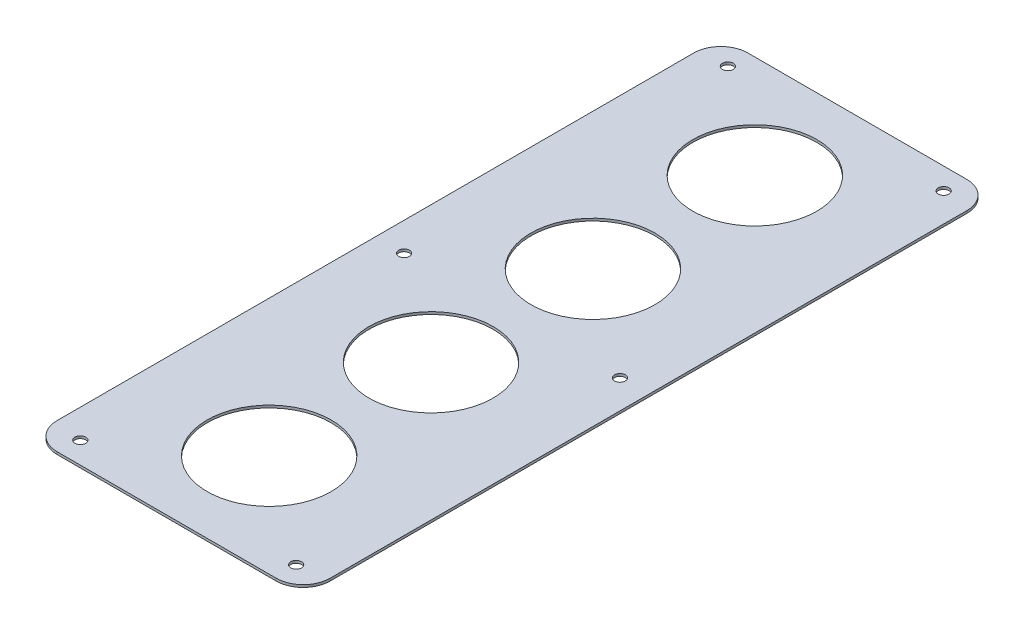
ISO-10303-21;
HEADER;
FILE_DESCRIPTION(('STEP AP214'),'2;1');
FILE_NAME('part.step','',(''),(''),'','','');
FILE_SCHEMA(('AUTOMOTIVE_DESIGN { 1 0 10303 214 1 1 1 1 }'));
ENDSEC;
DATA;
#1=APPLICATION_CONTEXT('core data for automotive mechanical design processes');
#2=APPLICATION_PROTOCOL_DEFINITION('international standard','automotive_design',2000,#1);
#3=PRODUCT_CONTEXT('',#1,'mechanical');
#4=PRODUCT('Part','Part','',(#3));
#5=PRODUCT_RELATED_PRODUCT_CATEGORY('part','',(#4));
#6=PRODUCT_DEFINITION_FORMATION('','',#4);
#7=PRODUCT_DEFINITION_CONTEXT('part definition',#1,'design');
#8=PRODUCT_DEFINITION('design','',#6,#7);
#9=PRODUCT_DEFINITION_SHAPE('','',#8);
#10=(LENGTH_UNIT() NAMED_UNIT(*) SI_UNIT(.MILLI.,.METRE.));
#11=(NAMED_UNIT(*) PLANE_ANGLE_UNIT() SI_UNIT($,.RADIAN.));
#12=(NAMED_UNIT(*) SI_UNIT($,.STERADIAN.) SOLID_ANGLE_UNIT());
#13=UNCERTAINTY_MEASURE_WITH_UNIT(LENGTH_MEASURE(1.E-05),#10,'distance_accuracy_value','');
#14=(GEOMETRIC_REPRESENTATION_CONTEXT(3) GLOBAL_UNCERTAINTY_ASSIGNED_CONTEXT((#13)) GLOBAL_UNIT_ASSIGNED_CONTEXT((#10,
#11,#12)) REPRESENTATION_CONTEXT('',''));
#15=CARTESIAN_POINT('',(0.,0.,0.));
#16=DIRECTION('',(0.,0.,1.));
#17=DIRECTION('',(1.,0.,0.));
#18=AXIS2_PLACEMENT_3D('',#15,#16,#17);
#19=CARTESIAN_POINT('',(0.,0.5842,0.));
#20=DIRECTION('',(0.,1.,0.));
#21=DIRECTION('',(0.,0.,1.));
#22=AXIS2_PLACEMENT_3D('',#19,#20,#21);
#23=PLANE('',#22);
#24=CARTESIAN_POINT('',(25.4,0.5842,-76.2));
#25=DIRECTION('',(0.,1.,0.));
#26=DIRECTION('',(0.,0.,1.));
#27=AXIS2_PLACEMENT_3D('',#24,#25,#26);
#28=CIRCLE('',#27,1.27);
#29=CARTESIAN_POINT('',(25.4,0.5842,-74.93));
#30=VERTEX_POINT('',#29);
#31=EDGE_CURVE('E155',#30,#30,#28,.F.);
#32=ORIENTED_EDGE('',*,*,#31,.T.);
#33=EDGE_LOOP('',(#32));
#34=FACE_BOUND('',#33,.T.);
#35=CARTESIAN_POINT('',(25.4,0.5842,0.));
#36=DIRECTION('',(0.,1.,0.));
#37=DIRECTION('',(0.,0.,1.));
#38=AXIS2_PLACEMENT_3D('',#35,#36,#37);
#39=CIRCLE('',#38,1.27);
#40=CARTESIAN_POINT('',(25.4,0.5842,1.27));
#41=VERTEX_POINT('',#40);
#42=EDGE_CURVE('E158',#41,#41,#39,.F.);
#43=ORIENTED_EDGE('',*,*,#42,.T.);
#44=EDGE_LOOP('',(#43));
#45=FACE_BOUND('',#44,.T.);
#46=CARTESIAN_POINT('',(25.4,0.5842,76.2));
#47=DIRECTION('',(0.,1.,0.));
#48=DIRECTION('',(0.,0.,1.));
#49=AXIS2_PLACEMENT_3D('',#46,#47,#48);
#50=CIRCLE('',#49,1.27);
#51=CARTESIAN_POINT('',(25.4,0.5842,77.47));
#52=VERTEX_POINT('',#51);
#53=EDGE_CURVE('E161',#52,#52,#50,.F.);
#54=ORIENTED_EDGE('',*,*,#53,.T.);
#55=EDGE_LOOP('',(#54));
#56=FACE_BOUND('',#55,.T.);
#57=CARTESIAN_POINT('',(-25.4,0.5842,76.2));
#58=DIRECTION('',(0.,1.,0.));
#59=DIRECTION('',(0.,0.,1.));
#60=AXIS2_PLACEMENT_3D('',#57,#58,#59);
#61=CIRCLE('',#60,1.27);
#62=CARTESIAN_POINT('',(-25.4,0.5842,77.47));
#63=VERTEX_POINT('',#62);
#64=EDGE_CURVE('E164',#63,#63,#61,.F.);
#65=ORIENTED_EDGE('',*,*,#64,.T.);
#66=EDGE_LOOP('',(#65));
#67=FACE_BOUND('',#66,.T.);
#68=CARTESIAN_POINT('',(-25.4,0.5842,0.));
#69=DIRECTION('',(0.,1.,0.));
#70=DIRECTION('',(0.,0.,1.));
#71=AXIS2_PLACEMENT_3D('',#68,#69,#70);
#72=CIRCLE('',#71,1.27);
#73=CARTESIAN_POINT('',(-25.4,0.5842,1.27));
#74=VERTEX_POINT('',#73);
#75=EDGE_CURVE('E167',#74,#74,#72,.F.);
#76=ORIENTED_EDGE('',*,*,#75,.T.);
#77=EDGE_LOOP('',(#76));
#78=FACE_BOUND('',#77,.T.);
#79=CARTESIAN_POINT('',(-25.4,0.5842,-76.2));
#80=DIRECTION('',(0.,1.,0.));
#81=DIRECTION('',(0.,0.,1.));
#82=AXIS2_PLACEMENT_3D('',#79,#80,#81);
#83=CIRCLE('',#82,1.27);
#84=CARTESIAN_POINT('',(-25.4,0.5842,-74.93));
#85=VERTEX_POINT('',#84);
#86=EDGE_CURVE('E170',#85,#85,#83,.F.);
#87=ORIENTED_EDGE('',*,*,#86,.T.);
#88=EDGE_LOOP('',(#87));
#89=FACE_BOUND('',#88,.T.);
#90=CARTESIAN_POINT('',(0.,0.5842,-57.15));
#91=DIRECTION('',(0.,-1.,0.));
#92=DIRECTION('',(0.,0.,-1.));
#93=AXIS2_PLACEMENT_3D('',#90,#91,#92);
#94=CIRCLE('',#93,14.605);
#95=CARTESIAN_POINT('',(0.,0.5842,-71.755));
#96=VERTEX_POINT('',#95);
#97=EDGE_CURVE('E173',#96,#96,#94,.T.);
#98=ORIENTED_EDGE('',*,*,#97,.T.);
#99=EDGE_LOOP('',(#98));
#100=FACE_BOUND('',#99,.T.);
#101=CARTESIAN_POINT('',(0.,0.5842,-19.05));
#102=DIRECTION('',(0.,-1.,0.));
#103=DIRECTION('',(0.,0.,-1.));
#104=AXIS2_PLACEMENT_3D('',#101,#102,#103);
#105=CIRCLE('',#104,14.605);
#106=CARTESIAN_POINT('',(0.,0.5842,-33.655));
#107=VERTEX_POINT('',#106);
#108=EDGE_CURVE('E176',#107,#107,#105,.T.);
#109=ORIENTED_EDGE('',*,*,#108,.T.);
#110=EDGE_LOOP('',(#109));
#111=FACE_BOUND('',#110,.T.);
#112=CARTESIAN_POINT('',(0.,0.5842,19.05));
#113=DIRECTION('',(0.,-1.,0.));
#114=DIRECTION('',(0.,0.,-1.));
#115=AXIS2_PLACEMENT_3D('',#112,#113,#114);
#116=CIRCLE('',#115,14.605);
#117=CARTESIAN_POINT('',(0.,0.5842,4.445));
#118=VERTEX_POINT('',#117);
#119=EDGE_CURVE('E179',#118,#118,#116,.T.);
#120=ORIENTED_EDGE('',*,*,#119,.T.);
#121=EDGE_LOOP('',(#120));
#122=FACE_BOUND('',#121,.T.);
#123=CARTESIAN_POINT('',(0.,0.5842,57.15));
#124=DIRECTION('',(0.,-1.,0.));
#125=DIRECTION('',(0.,0.,-1.));
#126=AXIS2_PLACEMENT_3D('',#123,#124,#125);
#127=CIRCLE('',#126,14.605);
#128=CARTESIAN_POINT('',(0.,0.5842,42.545));
#129=VERTEX_POINT('',#128);
#130=EDGE_CURVE('E182',#129,#129,#127,.T.);
#131=ORIENTED_EDGE('',*,*,#130,.T.);
#132=EDGE_LOOP('',(#131));
#133=FACE_BOUND('',#132,.T.);
#134=CARTESIAN_POINT('',(-25.781,0.5842,74.93));
#135=DIRECTION('',(0.,1.,0.));
#136=DIRECTION('',(0.,0.,1.));
#137=AXIS2_PLACEMENT_3D('',#134,#135,#136);
#138=CIRCLE('',#137,6.35);
#139=CARTESIAN_POINT('',(-25.781,0.5842,81.28));
#140=VERTEX_POINT('',#139);
#141=CARTESIAN_POINT('',(-32.131,0.5842,74.93));
#142=VERTEX_POINT('',#141);
#143=EDGE_CURVE('E95',#140,#142,#138,.F.);
#144=ORIENTED_EDGE('',*,*,#143,.F.);
#145=DIRECTION('',(1.,0.,0.));
#146=VECTOR('',#145,1.);
#147=CARTESIAN_POINT('',(-25.781,0.5842,81.28));
#148=LINE('',#147,#146);
#149=CARTESIAN_POINT('',(25.781,0.5842,81.28));
#150=VERTEX_POINT('',#149);
#151=EDGE_CURVE('E92',#150,#140,#148,.F.);
#152=ORIENTED_EDGE('',*,*,#151,.F.);
#153=CARTESIAN_POINT('',(25.781,0.5842,74.93));
#154=DIRECTION('',(0.,1.,0.));
#155=DIRECTION('',(0.,0.,1.));
#156=AXIS2_PLACEMENT_3D('',#153,#154,#155);
#157=CIRCLE('',#156,6.35);
#158=CARTESIAN_POINT('',(32.131,0.5842,74.93));
#159=VERTEX_POINT('',#158);
#160=EDGE_CURVE('E20',#159,#150,#157,.F.);
#161=ORIENTED_EDGE('',*,*,#160,.F.);
#162=DIRECTION('',(0.,0.,-1.));
#163=VECTOR('',#162,1.);
#164=CARTESIAN_POINT('',(32.131,0.5842,74.93));
#165=LINE('',#164,#163);
#166=CARTESIAN_POINT('',(32.131,0.5842,-74.93));
#167=VERTEX_POINT('',#166);
#168=EDGE_CURVE('E79',#167,#159,#165,.F.);
#169=ORIENTED_EDGE('',*,*,#168,.F.);
#170=CARTESIAN_POINT('',(25.781,0.5842,-74.93));
#171=DIRECTION('',(0.,1.,0.));
#172=DIRECTION('',(0.,0.,1.));
#173=AXIS2_PLACEMENT_3D('',#170,#171,#172);
#174=CIRCLE('',#173,6.35);
#175=CARTESIAN_POINT('',(25.781,0.5842,-81.28));
#176=VERTEX_POINT('',#175);
#177=EDGE_CURVE('E188',#176,#167,#174,.F.);
#178=ORIENTED_EDGE('',*,*,#177,.F.);
#179=DIRECTION('',(-1.,0.,0.));
#180=VECTOR('',#179,1.);
#181=CARTESIAN_POINT('',(25.781,0.5842,-81.28));
#182=LINE('',#181,#180);
#183=CARTESIAN_POINT('',(-25.781,0.5842,-81.28));
#184=VERTEX_POINT('',#183);
#185=EDGE_CURVE('E112',#184,#176,#182,.F.);
#186=ORIENTED_EDGE('',*,*,#185,.F.);
#187=CARTESIAN_POINT('',(-25.781,0.5842,-74.93));
#188=DIRECTION('',(0.,1.,0.));
#189=DIRECTION('',(0.,0.,1.));
#190=AXIS2_PLACEMENT_3D('',#187,#188,#189);
#191=CIRCLE('',#190,6.35);
#192=CARTESIAN_POINT('',(-32.131,0.5842,-74.93));
#193=VERTEX_POINT('',#192);
#194=EDGE_CURVE('E187',#193,#184,#191,.F.);
#195=ORIENTED_EDGE('',*,*,#194,.F.);
#196=DIRECTION('',(0.,0.,1.));
#197=VECTOR('',#196,1.);
#198=CARTESIAN_POINT('',(-32.131,0.5842,-74.93));
#199=LINE('',#198,#197);
#200=EDGE_CURVE('E108',#142,#193,#199,.F.);
#201=ORIENTED_EDGE('',*,*,#200,.F.);
#202=EDGE_LOOP('',(#144,#152,#161,#169,#178,#186,#195,#201));
#203=FACE_BOUND('',#202,.T.);
#204=ADVANCED_FACE('F17',(#34,#45,#56,#67,#78,#89,#100,#111,#122,#133,#203),#23,.T.);
#205=CARTESIAN_POINT('',(-25.781,0.,81.28));
#206=DIRECTION('',(0.,0.,1.));
#207=DIRECTION('',(1.,0.,0.));
#208=AXIS2_PLACEMENT_3D('',#205,#206,#207);
#209=PLANE('',#208);
#210=DIRECTION('',(0.,1.,0.));
#211=VECTOR('',#210,1.);
#212=CARTESIAN_POINT('',(-25.781,0.,81.28));
#213=LINE('',#212,#211);
#214=CARTESIAN_POINT('',(-25.781,0.,81.28));
#215=VERTEX_POINT('',#214);
#216=EDGE_CURVE('E186',#215,#140,#213,.T.);
#217=ORIENTED_EDGE('',*,*,#216,.F.);
#218=DIRECTION('',(1.,0.,0.));
#219=VECTOR('',#218,1.);
#220=CARTESIAN_POINT('',(0.,0.,81.28));
#221=LINE('',#220,#219);
#222=CARTESIAN_POINT('',(25.781,0.,81.28));
#223=VERTEX_POINT('',#222);
#224=EDGE_CURVE('E102',#215,#223,#221,.T.);
#225=ORIENTED_EDGE('',*,*,#224,.T.);
#226=DIRECTION('',(0.,1.,0.));
#227=VECTOR('',#226,1.);
#228=CARTESIAN_POINT('',(25.781,0.,81.28));
#229=LINE('',#228,#227);
#230=EDGE_CURVE('E88',#150,#223,#229,.F.);
#231=ORIENTED_EDGE('',*,*,#230,.F.);
#232=ORIENTED_EDGE('',*,*,#151,.T.);
#233=EDGE_LOOP('',(#217,#225,#231,#232));
#234=FACE_BOUND('',#233,.T.);
#235=ADVANCED_FACE('F101',(#234),#209,.T.);
#236=CARTESIAN_POINT('',(25.781,0.,74.93));
#237=DIRECTION('',(0.,1.,0.));
#238=DIRECTION('',(0.,0.,1.));
#239=AXIS2_PLACEMENT_3D('',#236,#237,#238);
#240=CYLINDRICAL_SURFACE('',#239,6.35);
#241=ORIENTED_EDGE('',*,*,#230,.T.);
#242=CARTESIAN_POINT('',(25.781,0.,74.93));
#243=DIRECTION('',(0.,1.,0.));
#244=DIRECTION('',(0.,0.,1.));
#245=AXIS2_PLACEMENT_3D('',#242,#243,#244);
#246=CIRCLE('',#245,6.35);
#247=CARTESIAN_POINT('',(32.131,0.,74.93));
#248=VERTEX_POINT('',#247);
#249=EDGE_CURVE('E153',#223,#248,#246,.T.);
#250=ORIENTED_EDGE('',*,*,#249,.T.);
#251=DIRECTION('',(0.,1.,0.));
#252=VECTOR('',#251,1.);
#253=CARTESIAN_POINT('',(32.131,0.,74.93));
#254=LINE('',#253,#252);
#255=EDGE_CURVE('E90',#159,#248,#254,.F.);
#256=ORIENTED_EDGE('',*,*,#255,.F.);
#257=ORIENTED_EDGE('',*,*,#160,.T.);
#258=EDGE_LOOP('',(#241,#250,#256,#257));
#259=FACE_BOUND('',#258,.T.);
#260=ADVANCED_FACE('F85',(#259),#240,.T.);
#261=CARTESIAN_POINT('',(32.131,0.,74.93));
#262=DIRECTION('',(1.,0.,0.));
#263=DIRECTION('',(0.,0.,-1.));
#264=AXIS2_PLACEMENT_3D('',#261,#262,#263);
#265=PLANE('',#264);
#266=ORIENTED_EDGE('',*,*,#255,.T.);
#267=DIRECTION('',(0.,0.,1.));
#268=VECTOR('',#267,1.);
#269=CARTESIAN_POINT('',(32.131,0.,0.));
#270=LINE('',#269,#268);
#271=CARTESIAN_POINT('',(32.131,0.,-74.93));
#272=VERTEX_POINT('',#271);
#273=EDGE_CURVE('E152',#248,#272,#270,.F.);
#274=ORIENTED_EDGE('',*,*,#273,.T.);
#275=DIRECTION('',(0.,1.,0.));
#276=VECTOR('',#275,1.);
#277=CARTESIAN_POINT('',(32.131,0.,-74.93));
#278=LINE('',#277,#276);
#279=EDGE_CURVE('E114',#167,#272,#278,.F.);
#280=ORIENTED_EDGE('',*,*,#279,.F.);
#281=ORIENTED_EDGE('',*,*,#168,.T.);
#282=EDGE_LOOP('',(#266,#274,#280,#281));
#283=FACE_BOUND('',#282,.T.);
#284=ADVANCED_FACE('F194',(#283),#265,.T.);
#285=CARTESIAN_POINT('',(25.781,0.,-74.93));
#286=DIRECTION('',(0.,1.,0.));
#287=DIRECTION('',(0.,0.,1.));
#288=AXIS2_PLACEMENT_3D('',#285,#286,#287);
#289=CYLINDRICAL_SURFACE('',#288,6.35);
#290=ORIENTED_EDGE('',*,*,#279,.T.);
#291=CARTESIAN_POINT('',(25.781,0.,-74.93));
#292=DIRECTION('',(0.,1.,0.));
#293=DIRECTION('',(0.,0.,1.));
#294=AXIS2_PLACEMENT_3D('',#291,#292,#293);
#295=CIRCLE('',#294,6.35);
#296=CARTESIAN_POINT('',(25.781,0.,-81.28));
#297=VERTEX_POINT('',#296);
#298=EDGE_CURVE('E149',#272,#297,#295,.T.);
#299=ORIENTED_EDGE('',*,*,#298,.T.);
#300=DIRECTION('',(0.,1.,0.));
#301=VECTOR('',#300,1.);
#302=CARTESIAN_POINT('',(25.781,0.,-81.28));
#303=LINE('',#302,#301);
#304=EDGE_CURVE('E113',#176,#297,#303,.F.);
#305=ORIENTED_EDGE('',*,*,#304,.F.);
#306=ORIENTED_EDGE('',*,*,#177,.T.);
#307=EDGE_LOOP('',(#290,#299,#305,#306));
#308=FACE_BOUND('',#307,.T.);
#309=ADVANCED_FACE('F215',(#308),#289,.T.);
#310=CARTESIAN_POINT('',(25.781,0.,-81.28));
#311=DIRECTION('',(0.,0.,-1.));
#312=DIRECTION('',(-1.,0.,0.));
#313=AXIS2_PLACEMENT_3D('',#310,#311,#312);
#314=PLANE('',#313);
#315=ORIENTED_EDGE('',*,*,#304,.T.);
#316=DIRECTION('',(1.,0.,0.));
#317=VECTOR('',#316,1.);
#318=CARTESIAN_POINT('',(0.,0.,-81.28));
#319=LINE('',#318,#317);
#320=CARTESIAN_POINT('',(-25.781,0.,-81.28));
#321=VERTEX_POINT('',#320);
#322=EDGE_CURVE('E148',#297,#321,#319,.F.);
#323=ORIENTED_EDGE('',*,*,#322,.T.);
#324=DIRECTION('',(0.,1.,0.));
#325=VECTOR('',#324,1.);
#326=CARTESIAN_POINT('',(-25.781,0.,-81.28));
#327=LINE('',#326,#325);
#328=EDGE_CURVE('E110',#184,#321,#327,.F.);
#329=ORIENTED_EDGE('',*,*,#328,.F.);
#330=ORIENTED_EDGE('',*,*,#185,.T.);
#331=EDGE_LOOP('',(#315,#323,#329,#330));
#332=FACE_BOUND('',#331,.T.);
#333=ADVANCED_FACE('F211',(#332),#314,.T.);
#334=CARTESIAN_POINT('',(-25.781,0.,-74.93));
#335=DIRECTION('',(0.,1.,0.));
#336=DIRECTION('',(0.,0.,1.));
#337=AXIS2_PLACEMENT_3D('',#334,#335,#336);
#338=CYLINDRICAL_SURFACE('',#337,6.35);
#339=ORIENTED_EDGE('',*,*,#328,.T.);
#340=CARTESIAN_POINT('',(-25.781,0.,-74.93));
#341=DIRECTION('',(0.,1.,0.));
#342=DIRECTION('',(0.,0.,1.));
#343=AXIS2_PLACEMENT_3D('',#340,#341,#342);
#344=CIRCLE('',#343,6.35);
#345=CARTESIAN_POINT('',(-32.131,0.,-74.93));
#346=VERTEX_POINT('',#345);
#347=EDGE_CURVE('E145',#321,#346,#344,.T.);
#348=ORIENTED_EDGE('',*,*,#347,.T.);
#349=DIRECTION('',(0.,1.,0.));
#350=VECTOR('',#349,1.);
#351=CARTESIAN_POINT('',(-32.131,0.,-74.93));
#352=LINE('',#351,#350);
#353=EDGE_CURVE('E109',#193,#346,#352,.F.);
#354=ORIENTED_EDGE('',*,*,#353,.F.);
#355=ORIENTED_EDGE('',*,*,#194,.T.);
#356=EDGE_LOOP('',(#339,#348,#354,#355));
#357=FACE_BOUND('',#356,.T.);
#358=ADVANCED_FACE('F223',(#357),#338,.T.);
#359=CARTESIAN_POINT('',(-32.131,0.,-74.93));
#360=DIRECTION('',(-1.,0.,0.));
#361=DIRECTION('',(0.,0.,1.));
#362=AXIS2_PLACEMENT_3D('',#359,#360,#361);
#363=PLANE('',#362);
#364=ORIENTED_EDGE('',*,*,#353,.T.);
#365=DIRECTION('',(0.,0.,1.));
#366=VECTOR('',#365,1.);
#367=CARTESIAN_POINT('',(-32.131,0.,0.));
#368=LINE('',#367,#366);
#369=CARTESIAN_POINT('',(-32.131,0.,74.93));
#370=VERTEX_POINT('',#369);
#371=EDGE_CURVE('E144',#346,#370,#368,.T.);
#372=ORIENTED_EDGE('',*,*,#371,.T.);
#373=DIRECTION('',(0.,1.,0.));
#374=VECTOR('',#373,1.);
#375=CARTESIAN_POINT('',(-32.131,0.,74.93));
#376=LINE('',#375,#374);
#377=EDGE_CURVE('E35',#142,#370,#376,.F.);
#378=ORIENTED_EDGE('',*,*,#377,.F.);
#379=ORIENTED_EDGE('',*,*,#200,.T.);
#380=EDGE_LOOP('',(#364,#372,#378,#379));
#381=FACE_BOUND('',#380,.T.);
#382=ADVANCED_FACE('F277',(#381),#363,.T.);
#383=CARTESIAN_POINT('',(-25.781,0.,74.93));
#384=DIRECTION('',(0.,1.,0.));
#385=DIRECTION('',(0.,0.,1.));
#386=AXIS2_PLACEMENT_3D('',#383,#384,#385);
#387=CYLINDRICAL_SURFACE('',#386,6.35);
#388=ORIENTED_EDGE('',*,*,#377,.T.);
#389=CARTESIAN_POINT('',(-25.781,0.,74.93));
#390=DIRECTION('',(0.,1.,0.));
#391=DIRECTION('',(0.,0.,1.));
#392=AXIS2_PLACEMENT_3D('',#389,#390,#391);
#393=CIRCLE('',#392,6.35);
#394=EDGE_CURVE('E142',#370,#215,#393,.T.);
#395=ORIENTED_EDGE('',*,*,#394,.T.);
#396=ORIENTED_EDGE('',*,*,#216,.T.);
#397=ORIENTED_EDGE('',*,*,#143,.T.);
#398=EDGE_LOOP('',(#388,#395,#396,#397));
#399=FACE_BOUND('',#398,.T.);
#400=ADVANCED_FACE('F273',(#399),#387,.T.);
#401=CARTESIAN_POINT('',(0.,0.5842,57.15));
#402=DIRECTION('',(0.,-1.,0.));
#403=DIRECTION('',(0.,0.,-1.));
#404=AXIS2_PLACEMENT_3D('',#401,#402,#403);
#405=CYLINDRICAL_SURFACE('',#404,14.605);
#406=ORIENTED_EDGE('',*,*,#130,.F.);
#407=EDGE_LOOP('',(#406));
#408=FACE_BOUND('',#407,.T.);
#409=CARTESIAN_POINT('',(0.,0.,57.15));
#410=DIRECTION('',(0.,-1.,0.));
#411=DIRECTION('',(0.,0.,-1.));
#412=AXIS2_PLACEMENT_3D('',#409,#410,#411);
#413=CIRCLE('',#412,14.605);
#414=CARTESIAN_POINT('',(0.,0.,42.545));
#415=VERTEX_POINT('',#414);
#416=EDGE_CURVE('E139',#415,#415,#413,.T.);
#417=ORIENTED_EDGE('',*,*,#416,.T.);
#418=EDGE_LOOP('',(#417));
#419=FACE_BOUND('',#418,.T.);
#420=ADVANCED_FACE('F269',(#408,#419),#405,.F.);
#421=CARTESIAN_POINT('',(0.,0.5842,19.05));
#422=DIRECTION('',(0.,-1.,0.));
#423=DIRECTION('',(0.,0.,-1.));
#424=AXIS2_PLACEMENT_3D('',#421,#422,#423);
#425=CYLINDRICAL_SURFACE('',#424,14.605);
#426=ORIENTED_EDGE('',*,*,#119,.F.);
#427=EDGE_LOOP('',(#426));
#428=FACE_BOUND('',#427,.T.);
#429=CARTESIAN_POINT('',(0.,0.,19.05));
#430=DIRECTION('',(0.,-1.,0.));
#431=DIRECTION('',(0.,0.,-1.));
#432=AXIS2_PLACEMENT_3D('',#429,#430,#431);
#433=CIRCLE('',#432,14.605);
#434=CARTESIAN_POINT('',(0.,0.,4.445));
#435=VERTEX_POINT('',#434);
#436=EDGE_CURVE('E136',#435,#435,#433,.T.);
#437=ORIENTED_EDGE('',*,*,#436,.T.);
#438=EDGE_LOOP('',(#437));
#439=FACE_BOUND('',#438,.T.);
#440=ADVANCED_FACE('F265',(#428,#439),#425,.F.);
#441=CARTESIAN_POINT('',(0.,0.5842,-19.05));
#442=DIRECTION('',(0.,-1.,0.));
#443=DIRECTION('',(0.,0.,-1.));
#444=AXIS2_PLACEMENT_3D('',#441,#442,#443);
#445=CYLINDRICAL_SURFACE('',#444,14.605);
#446=ORIENTED_EDGE('',*,*,#108,.F.);
#447=EDGE_LOOP('',(#446));
#448=FACE_BOUND('',#447,.T.);
#449=CARTESIAN_POINT('',(0.,0.,-19.05));
#450=DIRECTION('',(0.,-1.,0.));
#451=DIRECTION('',(0.,0.,-1.));
#452=AXIS2_PLACEMENT_3D('',#449,#450,#451);
#453=CIRCLE('',#452,14.605);
#454=CARTESIAN_POINT('',(0.,0.,-33.655));
#455=VERTEX_POINT('',#454);
#456=EDGE_CURVE('E133',#455,#455,#453,.T.);
#457=ORIENTED_EDGE('',*,*,#456,.T.);
#458=EDGE_LOOP('',(#457));
#459=FACE_BOUND('',#458,.T.);
#460=ADVANCED_FACE('F261',(#448,#459),#445,.F.);
#461=CARTESIAN_POINT('',(0.,0.5842,-57.15));
#462=DIRECTION('',(0.,-1.,0.));
#463=DIRECTION('',(0.,0.,-1.));
#464=AXIS2_PLACEMENT_3D('',#461,#462,#463);
#465=CYLINDRICAL_SURFACE('',#464,14.605);
#466=ORIENTED_EDGE('',*,*,#97,.F.);
#467=EDGE_LOOP('',(#466));
#468=FACE_BOUND('',#467,.T.);
#469=CARTESIAN_POINT('',(0.,0.,-57.15));
#470=DIRECTION('',(0.,-1.,0.));
#471=DIRECTION('',(0.,0.,-1.));
#472=AXIS2_PLACEMENT_3D('',#469,#470,#471);
#473=CIRCLE('',#472,14.605);
#474=CARTESIAN_POINT('',(0.,0.,-71.755));
#475=VERTEX_POINT('',#474);
#476=EDGE_CURVE('E130',#475,#475,#473,.T.);
#477=ORIENTED_EDGE('',*,*,#476,.T.);
#478=EDGE_LOOP('',(#477));
#479=FACE_BOUND('',#478,.T.);
#480=ADVANCED_FACE('F257',(#468,#479),#465,.F.);
#481=CARTESIAN_POINT('',(-25.4,0.5842,-76.2));
#482=DIRECTION('',(0.,1.,0.));
#483=DIRECTION('',(0.,0.,1.));
#484=AXIS2_PLACEMENT_3D('',#481,#482,#483);
#485=CYLINDRICAL_SURFACE('',#484,1.27);
#486=ORIENTED_EDGE('',*,*,#86,.F.);
#487=EDGE_LOOP('',(#486));
#488=FACE_BOUND('',#487,.T.);
#489=CARTESIAN_POINT('',(-25.4,0.,-76.2));
#490=DIRECTION('',(0.,1.,0.));
#491=DIRECTION('',(0.,0.,1.));
#492=AXIS2_PLACEMENT_3D('',#489,#490,#491);
#493=CIRCLE('',#492,1.27);
#494=CARTESIAN_POINT('',(-25.4,0.,-74.93));
#495=VERTEX_POINT('',#494);
#496=EDGE_CURVE('E127',#495,#495,#493,.F.);
#497=ORIENTED_EDGE('',*,*,#496,.T.);
#498=EDGE_LOOP('',(#497));
#499=FACE_BOUND('',#498,.T.);
#500=ADVANCED_FACE('F253',(#488,#499),#485,.F.);
#501=CARTESIAN_POINT('',(-25.4,0.5842,0.));
#502=DIRECTION('',(0.,1.,0.));
#503=DIRECTION('',(0.,0.,1.));
#504=AXIS2_PLACEMENT_3D('',#501,#502,#503);
#505=CYLINDRICAL_SURFACE('',#504,1.27);
#506=ORIENTED_EDGE('',*,*,#75,.F.);
#507=EDGE_LOOP('',(#506));
#508=FACE_BOUND('',#507,.T.);
#509=CARTESIAN_POINT('',(-25.4,0.,0.));
#510=DIRECTION('',(0.,1.,0.));
#511=DIRECTION('',(0.,0.,1.));
#512=AXIS2_PLACEMENT_3D('',#509,#510,#511);
#513=CIRCLE('',#512,1.27);
#514=CARTESIAN_POINT('',(-25.4,0.,1.27));
#515=VERTEX_POINT('',#514);
#516=EDGE_CURVE('E124',#515,#515,#513,.F.);
#517=ORIENTED_EDGE('',*,*,#516,.T.);
#518=EDGE_LOOP('',(#517));
#519=FACE_BOUND('',#518,.T.);
#520=ADVANCED_FACE('F249',(#508,#519),#505,.F.);
#521=CARTESIAN_POINT('',(-25.4,0.5842,76.2));
#522=DIRECTION('',(0.,1.,0.));
#523=DIRECTION('',(0.,0.,1.));
#524=AXIS2_PLACEMENT_3D('',#521,#522,#523);
#525=CYLINDRICAL_SURFACE('',#524,1.27);
#526=ORIENTED_EDGE('',*,*,#64,.F.);
#527=EDGE_LOOP('',(#526));
#528=FACE_BOUND('',#527,.T.);
#529=CARTESIAN_POINT('',(-25.4,0.,76.2));
#530=DIRECTION('',(0.,1.,0.));
#531=DIRECTION('',(0.,0.,1.));
#532=AXIS2_PLACEMENT_3D('',#529,#530,#531);
#533=CIRCLE('',#532,1.27);
#534=CARTESIAN_POINT('',(-25.4,0.,77.47));
#535=VERTEX_POINT('',#534);
#536=EDGE_CURVE('E121',#535,#535,#533,.F.);
#537=ORIENTED_EDGE('',*,*,#536,.T.);
#538=EDGE_LOOP('',(#537));
#539=FACE_BOUND('',#538,.T.);
#540=ADVANCED_FACE('F245',(#528,#539),#525,.F.);
#541=CARTESIAN_POINT('',(25.4,0.5842,76.2));
#542=DIRECTION('',(0.,1.,0.));
#543=DIRECTION('',(0.,0.,1.));
#544=AXIS2_PLACEMENT_3D('',#541,#542,#543);
#545=CYLINDRICAL_SURFACE('',#544,1.27);
#546=ORIENTED_EDGE('',*,*,#53,.F.);
#547=EDGE_LOOP('',(#546));
#548=FACE_BOUND('',#547,.T.);
#549=CARTESIAN_POINT('',(25.4,0.,76.2));
#550=DIRECTION('',(0.,1.,0.));
#551=DIRECTION('',(0.,0.,1.));
#552=AXIS2_PLACEMENT_3D('',#549,#550,#551);
#553=CIRCLE('',#552,1.27);
#554=CARTESIAN_POINT('',(25.4,0.,77.47));
#555=VERTEX_POINT('',#554);
#556=EDGE_CURVE('E118',#555,#555,#553,.F.);
#557=ORIENTED_EDGE('',*,*,#556,.T.);
#558=EDGE_LOOP('',(#557));
#559=FACE_BOUND('',#558,.T.);
#560=ADVANCED_FACE('F241',(#548,#559),#545,.F.);
#561=CARTESIAN_POINT('',(25.4,0.5842,0.));
#562=DIRECTION('',(0.,1.,0.));
#563=DIRECTION('',(0.,0.,1.));
#564=AXIS2_PLACEMENT_3D('',#561,#562,#563);
#565=CYLINDRICAL_SURFACE('',#564,1.27);
#566=ORIENTED_EDGE('',*,*,#42,.F.);
#567=EDGE_LOOP('',(#566));
#568=FACE_BOUND('',#567,.T.);
#569=CARTESIAN_POINT('',(25.4,0.,0.));
#570=DIRECTION('',(0.,1.,0.));
#571=DIRECTION('',(0.,0.,1.));
#572=AXIS2_PLACEMENT_3D('',#569,#570,#571);
#573=CIRCLE('',#572,1.27);
#574=CARTESIAN_POINT('',(25.4,0.,1.27));
#575=VERTEX_POINT('',#574);
#576=EDGE_CURVE('E26',#575,#575,#573,.F.);
#577=ORIENTED_EDGE('',*,*,#576,.T.);
#578=EDGE_LOOP('',(#577));
#579=FACE_BOUND('',#578,.T.);
#580=ADVANCED_FACE('F233',(#568,#579),#565,.F.);
#581=CARTESIAN_POINT('',(25.4,0.5842,-76.2));
#582=DIRECTION('',(0.,1.,0.));
#583=DIRECTION('',(0.,0.,1.));
#584=AXIS2_PLACEMENT_3D('',#581,#582,#583);
#585=CYLINDRICAL_SURFACE('',#584,1.27);
#586=ORIENTED_EDGE('',*,*,#31,.F.);
#587=EDGE_LOOP('',(#586));
#588=FACE_BOUND('',#587,.T.);
#589=CARTESIAN_POINT('',(25.4,0.,-76.2));
#590=DIRECTION('',(0.,1.,0.));
#591=DIRECTION('',(0.,0.,1.));
#592=AXIS2_PLACEMENT_3D('',#589,#590,#591);
#593=CIRCLE('',#592,1.27);
#594=CARTESIAN_POINT('',(25.4,0.,-74.93));
#595=VERTEX_POINT('',#594);
#596=EDGE_CURVE('E11',#595,#595,#593,.F.);
#597=ORIENTED_EDGE('',*,*,#596,.T.);
#598=EDGE_LOOP('',(#597));
#599=FACE_BOUND('',#598,.T.);
#600=ADVANCED_FACE('F227',(#588,#599),#585,.F.);
#601=CARTESIAN_POINT('',(0.,0.,0.));
#602=DIRECTION('',(0.,1.,0.));
#603=DIRECTION('',(0.,0.,1.));
#604=AXIS2_PLACEMENT_3D('',#601,#602,#603);
#605=PLANE('',#604);
#606=ORIENTED_EDGE('',*,*,#596,.F.);
#607=EDGE_LOOP('',(#606));
#608=FACE_BOUND('',#607,.T.);
#609=ORIENTED_EDGE('',*,*,#576,.F.);
#610=EDGE_LOOP('',(#609));
#611=FACE_BOUND('',#610,.T.);
#612=ORIENTED_EDGE('',*,*,#556,.F.);
#613=EDGE_LOOP('',(#612));
#614=FACE_BOUND('',#613,.T.);
#615=ORIENTED_EDGE('',*,*,#536,.F.);
#616=EDGE_LOOP('',(#615));
#617=FACE_BOUND('',#616,.T.);
#618=ORIENTED_EDGE('',*,*,#516,.F.);
#619=EDGE_LOOP('',(#618));
#620=FACE_BOUND('',#619,.T.);
#621=ORIENTED_EDGE('',*,*,#496,.F.);
#622=EDGE_LOOP('',(#621));
#623=FACE_BOUND('',#622,.T.);
#624=ORIENTED_EDGE('',*,*,#476,.F.);
#625=EDGE_LOOP('',(#624));
#626=FACE_BOUND('',#625,.T.);
#627=ORIENTED_EDGE('',*,*,#456,.F.);
#628=EDGE_LOOP('',(#627));
#629=FACE_BOUND('',#628,.T.);
#630=ORIENTED_EDGE('',*,*,#436,.F.);
#631=EDGE_LOOP('',(#630));
#632=FACE_BOUND('',#631,.T.);
#633=ORIENTED_EDGE('',*,*,#416,.F.);
#634=EDGE_LOOP('',(#633));
#635=FACE_BOUND('',#634,.T.);
#636=ORIENTED_EDGE('',*,*,#371,.F.);
#637=ORIENTED_EDGE('',*,*,#347,.F.);
#638=ORIENTED_EDGE('',*,*,#322,.F.);
#639=ORIENTED_EDGE('',*,*,#298,.F.);
#640=ORIENTED_EDGE('',*,*,#273,.F.);
#641=ORIENTED_EDGE('',*,*,#249,.F.);
#642=ORIENTED_EDGE('',*,*,#224,.F.);
#643=ORIENTED_EDGE('',*,*,#394,.F.);
#644=EDGE_LOOP('',(#636,#637,#638,#639,#640,#641,#642,#643));
#645=FACE_BOUND('',#644,.T.);
#646=ADVANCED_FACE('F198',(#608,#611,#614,#617,#620,#623,#626,#629,#632,#635,#645),#605,.F.);
#647=CLOSED_SHELL('',(#204,#235,#260,#284,#309,#333,#358,#382,#400,#420,#440,#460,#480,#500,
#520,#540,#560,#580,#600,#646));
#648=MANIFOLD_SOLID_BREP('B1',#647);
#649=ADVANCED_BREP_SHAPE_REPRESENTATION('',(#18,#648),#14);
#650=SHAPE_DEFINITION_REPRESENTATION(#9,#649);
ENDSEC;
END-ISO-10303-21;
